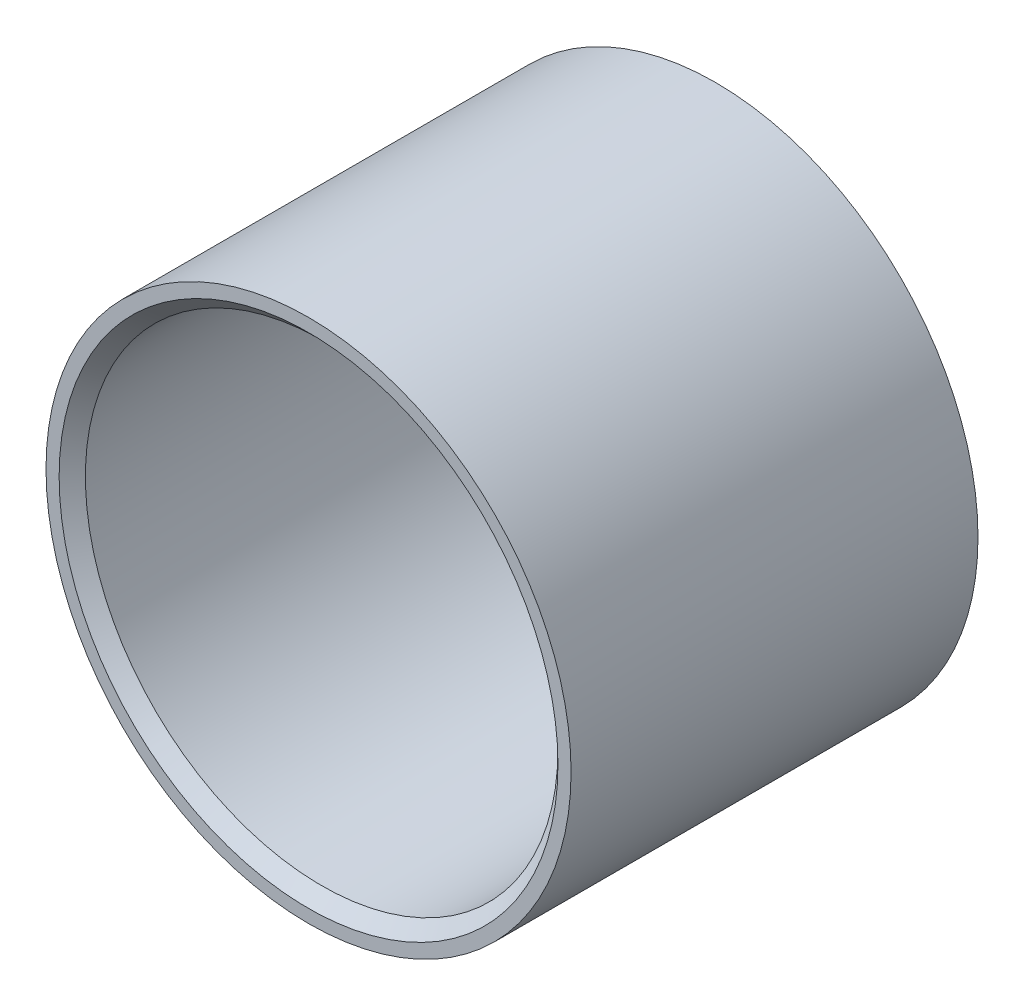
ISO-10303-21;
HEADER;
FILE_DESCRIPTION(('STEP AP214'),'2;1');
FILE_NAME('part.step','',(''),(''),'','','');
FILE_SCHEMA(('AUTOMOTIVE_DESIGN { 1 0 10303 214 1 1 1 1 }'));
ENDSEC;
DATA;
#1=APPLICATION_CONTEXT('core data for automotive mechanical design processes');
#2=APPLICATION_PROTOCOL_DEFINITION('international standard','automotive_design',2000,#1);
#3=PRODUCT_CONTEXT('',#1,'mechanical');
#4=PRODUCT('Part','Part','',(#3));
#5=PRODUCT_RELATED_PRODUCT_CATEGORY('part','',(#4));
#6=PRODUCT_DEFINITION_FORMATION('','',#4);
#7=PRODUCT_DEFINITION_CONTEXT('part definition',#1,'design');
#8=PRODUCT_DEFINITION('design','',#6,#7);
#9=PRODUCT_DEFINITION_SHAPE('','',#8);
#10=(LENGTH_UNIT() NAMED_UNIT(*) SI_UNIT(.MILLI.,.METRE.));
#11=(NAMED_UNIT(*) PLANE_ANGLE_UNIT() SI_UNIT($,.RADIAN.));
#12=(NAMED_UNIT(*) SI_UNIT($,.STERADIAN.) SOLID_ANGLE_UNIT());
#13=UNCERTAINTY_MEASURE_WITH_UNIT(LENGTH_MEASURE(1.E-05),#10,'distance_accuracy_value','');
#14=(GEOMETRIC_REPRESENTATION_CONTEXT(3) GLOBAL_UNCERTAINTY_ASSIGNED_CONTEXT((#13)) GLOBAL_UNIT_ASSIGNED_CONTEXT((#10,
#11,#12)) REPRESENTATION_CONTEXT('',''));
#15=CARTESIAN_POINT('',(0.,0.,0.));
#16=DIRECTION('',(0.,0.,1.));
#17=DIRECTION('',(1.,0.,0.));
#18=AXIS2_PLACEMENT_3D('',#15,#16,#17);
#19=CARTESIAN_POINT('',(0.,0.,15.5));
#20=DIRECTION('',(0.,0.,1.));
#21=DIRECTION('',(1.,0.,0.));
#22=AXIS2_PLACEMENT_3D('',#19,#20,#21);
#23=PLANE('',#22);
#24=CARTESIAN_POINT('',(0.,0.,15.5));
#25=DIRECTION('',(0.,0.,1.));
#26=DIRECTION('',(1.,0.,0.));
#27=AXIS2_PLACEMENT_3D('',#24,#25,#26);
#28=CIRCLE('',#27,9.5);
#29=CARTESIAN_POINT('',(9.5,0.,15.5));
#30=VERTEX_POINT('',#29);
#31=EDGE_CURVE('E10',#30,#30,#28,.F.);
#32=ORIENTED_EDGE('',*,*,#31,.T.);
#33=EDGE_LOOP('',(#32));
#34=FACE_BOUND('',#33,.T.);
#35=CARTESIAN_POINT('',(0.,0.,15.5));
#36=DIRECTION('',(0.,0.,1.));
#37=DIRECTION('',(1.,0.,0.));
#38=AXIS2_PLACEMENT_3D('',#35,#36,#37);
#39=CIRCLE('',#38,10.);
#40=CARTESIAN_POINT('',(10.,0.,15.5));
#41=VERTEX_POINT('',#40);
#42=EDGE_CURVE('E57',#41,#41,#39,.T.);
#43=ORIENTED_EDGE('',*,*,#42,.T.);
#44=EDGE_LOOP('',(#43));
#45=FACE_BOUND('',#44,.T.);
#46=ADVANCED_FACE('F43',(#34,#45),#23,.T.);
#47=CARTESIAN_POINT('',(0.,0.,0.));
#48=DIRECTION('',(0.,0.,1.));
#49=DIRECTION('',(1.,0.,0.));
#50=AXIS2_PLACEMENT_3D('',#47,#48,#49);
#51=PLANE('',#50);
#52=CARTESIAN_POINT('',(0.,0.,0.));
#53=DIRECTION('',(0.,0.,1.));
#54=DIRECTION('',(1.,0.,0.));
#55=AXIS2_PLACEMENT_3D('',#52,#53,#54);
#56=CIRCLE('',#55,10.);
#57=CARTESIAN_POINT('',(10.,0.,0.));
#58=VERTEX_POINT('',#57);
#59=EDGE_CURVE('E62',#58,#58,#56,.T.);
#60=ORIENTED_EDGE('',*,*,#59,.F.);
#61=EDGE_LOOP('',(#60));
#62=FACE_BOUND('',#61,.T.);
#63=CARTESIAN_POINT('',(0.,0.,0.));
#64=DIRECTION('',(0.,0.,1.));
#65=DIRECTION('',(1.,0.,0.));
#66=AXIS2_PLACEMENT_3D('',#63,#64,#65);
#67=CIRCLE('',#66,9.);
#68=CARTESIAN_POINT('',(9.,0.,0.));
#69=VERTEX_POINT('',#68);
#70=EDGE_CURVE('E67',#69,#69,#67,.T.);
#71=ORIENTED_EDGE('',*,*,#70,.T.);
#72=EDGE_LOOP('',(#71));
#73=FACE_BOUND('',#72,.T.);
#74=ADVANCED_FACE('F73',(#62,#73),#51,.F.);
#75=CARTESIAN_POINT('',(0.,0.,15.5));
#76=DIRECTION('',(0.,0.,-1.));
#77=DIRECTION('',(-1.,0.,0.));
#78=AXIS2_PLACEMENT_3D('',#75,#76,#77);
#79=CYLINDRICAL_SURFACE('',#78,10.);
#80=ORIENTED_EDGE('',*,*,#42,.F.);
#81=EDGE_LOOP('',(#80));
#82=FACE_BOUND('',#81,.T.);
#83=ORIENTED_EDGE('',*,*,#59,.T.);
#84=EDGE_LOOP('',(#83));
#85=FACE_BOUND('',#84,.T.);
#86=ADVANCED_FACE('F77',(#82,#85),#79,.T.);
#87=CARTESIAN_POINT('',(0.,0.,15.5));
#88=DIRECTION('',(0.,0.,-1.));
#89=DIRECTION('',(-1.,0.,0.));
#90=AXIS2_PLACEMENT_3D('',#87,#88,#89);
#91=CYLINDRICAL_SURFACE('',#90,9.);
#92=CARTESIAN_POINT('',(0.,0.,15.));
#93=DIRECTION('',(0.,0.,1.));
#94=DIRECTION('',(1.,0.,0.));
#95=AXIS2_PLACEMENT_3D('',#92,#93,#94);
#96=CIRCLE('',#95,9.);
#97=CARTESIAN_POINT('',(9.,0.,15.));
#98=VERTEX_POINT('',#97);
#99=EDGE_CURVE('E52',#98,#98,#96,.T.);
#100=ORIENTED_EDGE('',*,*,#99,.T.);
#101=EDGE_LOOP('',(#100));
#102=FACE_BOUND('',#101,.T.);
#103=ORIENTED_EDGE('',*,*,#70,.F.);
#104=EDGE_LOOP('',(#103));
#105=FACE_BOUND('',#104,.T.);
#106=ADVANCED_FACE('F75',(#102,#105),#91,.F.);
#107=CARTESIAN_POINT('',(0.,0.,15.));
#108=DIRECTION('',(0.,0.,1.));
#109=DIRECTION('',(1.,0.,0.));
#110=AXIS2_PLACEMENT_3D('',#107,#108,#109);
#111=CONICAL_SURFACE('',#110,9.,0.785398163397448);
#112=ORIENTED_EDGE('',*,*,#31,.F.);
#113=EDGE_LOOP('',(#112));
#114=FACE_BOUND('',#113,.T.);
#115=ORIENTED_EDGE('',*,*,#99,.F.);
#116=EDGE_LOOP('',(#115));
#117=FACE_BOUND('',#116,.T.);
#118=ADVANCED_FACE('F46',(#114,#117),#111,.F.);
#119=CLOSED_SHELL('',(#46,#74,#86,#106,#118));
#120=MANIFOLD_SOLID_BREP('B2',#119);
#121=ADVANCED_BREP_SHAPE_REPRESENTATION('',(#18,#120),#14);
#122=SHAPE_DEFINITION_REPRESENTATION(#9,#121);
ENDSEC;
END-ISO-10303-21;
